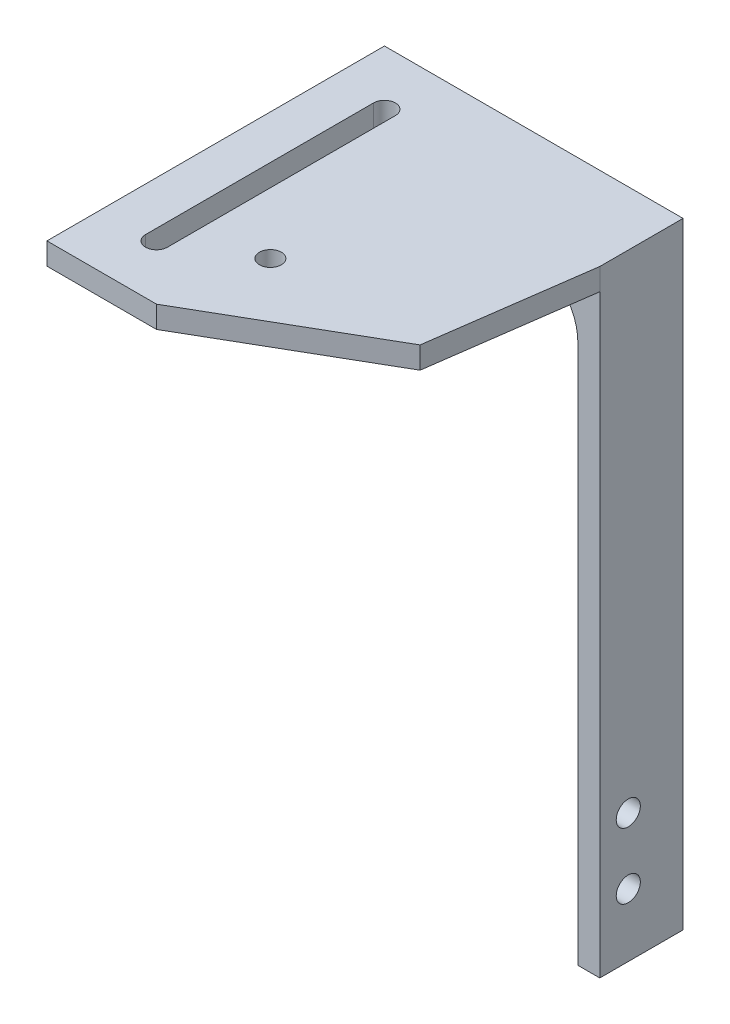
ISO-10303-21;
HEADER;
FILE_DESCRIPTION(('STEP AP214'),'2;1');
FILE_NAME('part.step','',(''),(''),'','','');
FILE_SCHEMA(('AUTOMOTIVE_DESIGN { 1 0 10303 214 1 1 1 1 }'));
ENDSEC;
DATA;
#1=APPLICATION_CONTEXT('core data for automotive mechanical design processes');
#2=APPLICATION_PROTOCOL_DEFINITION('international standard','automotive_design',2000,#1);
#3=PRODUCT_CONTEXT('',#1,'mechanical');
#4=PRODUCT('Part','Part','',(#3));
#5=PRODUCT_RELATED_PRODUCT_CATEGORY('part','',(#4));
#6=PRODUCT_DEFINITION_FORMATION('','',#4);
#7=PRODUCT_DEFINITION_CONTEXT('part definition',#1,'design');
#8=PRODUCT_DEFINITION('design','',#6,#7);
#9=PRODUCT_DEFINITION_SHAPE('','',#8);
#10=(LENGTH_UNIT() NAMED_UNIT(*) SI_UNIT(.MILLI.,.METRE.));
#11=(NAMED_UNIT(*) PLANE_ANGLE_UNIT() SI_UNIT($,.RADIAN.));
#12=(NAMED_UNIT(*) SI_UNIT($,.STERADIAN.) SOLID_ANGLE_UNIT());
#13=UNCERTAINTY_MEASURE_WITH_UNIT(LENGTH_MEASURE(1.E-05),#10,'distance_accuracy_value','');
#14=(GEOMETRIC_REPRESENTATION_CONTEXT(3) GLOBAL_UNCERTAINTY_ASSIGNED_CONTEXT((#13)) GLOBAL_UNIT_ASSIGNED_CONTEXT((#10,
#11,#12)) REPRESENTATION_CONTEXT('',''));
#15=CARTESIAN_POINT('',(0.,0.,0.));
#16=DIRECTION('',(0.,0.,1.));
#17=DIRECTION('',(1.,0.,0.));
#18=AXIS2_PLACEMENT_3D('',#15,#16,#17);
#19=CARTESIAN_POINT('',(60.75,0.,0.));
#20=DIRECTION('',(-1.,0.,0.));
#21=DIRECTION('',(0.,1.,0.));
#22=AXIS2_PLACEMENT_3D('',#19,#20,#21);
#23=PLANE('',#22);
#24=CARTESIAN_POINT('',(60.75,3.50000000000001,1.));
#25=DIRECTION('',(1.,0.,0.));
#26=DIRECTION('',(0.,1.,0.));
#27=AXIS2_PLACEMENT_3D('',#24,#25,#26);
#28=CIRCLE('',#27,1.1);
#29=CARTESIAN_POINT('',(60.75,4.60000000000001,1.));
#30=VERTEX_POINT('',#29);
#31=EDGE_CURVE('E185',#30,#30,#28,.T.);
#32=ORIENTED_EDGE('',*,*,#31,.T.);
#33=EDGE_LOOP('',(#32));
#34=FACE_BOUND('',#33,.T.);
#35=CARTESIAN_POINT('',(60.75,9.50000000000001,1.));
#36=DIRECTION('',(1.,0.,0.));
#37=DIRECTION('',(0.,1.,0.));
#38=AXIS2_PLACEMENT_3D('',#35,#36,#37);
#39=CIRCLE('',#38,1.1);
#40=CARTESIAN_POINT('',(60.75,10.6,1.));
#41=VERTEX_POINT('',#40);
#42=EDGE_CURVE('E177',#41,#41,#39,.T.);
#43=ORIENTED_EDGE('',*,*,#42,.T.);
#44=EDGE_LOOP('',(#43));
#45=FACE_BOUND('',#44,.T.);
#46=DIRECTION('',(0.,1.,0.));
#47=VECTOR('',#46,1.);
#48=CARTESIAN_POINT('',(60.75,-2.24999999999999,-4.));
#49=LINE('',#48,#47);
#50=CARTESIAN_POINT('',(60.75,-2.24999999999999,-4.));
#51=VERTEX_POINT('',#50);
#52=CARTESIAN_POINT('',(60.75,46.986195028983,-4.));
#53=VERTEX_POINT('',#52);
#54=EDGE_CURVE('E194',#51,#53,#49,.T.);
#55=ORIENTED_EDGE('',*,*,#54,.F.);
#56=DIRECTION('',(0.,0.,-1.));
#57=VECTOR('',#56,1.);
#58=CARTESIAN_POINT('',(60.75,-2.24999999999999,3.59922622331936));
#59=LINE('',#58,#57);
#60=CARTESIAN_POINT('',(60.75,-2.24999999999999,3.59922622331936));
#61=VERTEX_POINT('',#60);
#62=EDGE_CURVE('E191',#61,#51,#59,.T.);
#63=ORIENTED_EDGE('',*,*,#62,.F.);
#64=DIRECTION('',(0.,-1.,0.));
#65=VECTOR('',#64,1.);
#66=CARTESIAN_POINT('',(60.75,53.986195028983,3.59922622331937));
#67=LINE('',#66,#65);
#68=CARTESIAN_POINT('',(60.75,46.986195028983,3.59922622331937));
#69=VERTEX_POINT('',#68);
#70=EDGE_CURVE('E198',#69,#61,#67,.T.);
#71=ORIENTED_EDGE('',*,*,#70,.F.);
#72=DIRECTION('',(0.,0.,-1.));
#73=VECTOR('',#72,1.);
#74=CARTESIAN_POINT('',(60.75,46.986195028983,0.));
#75=LINE('',#74,#73);
#76=EDGE_CURVE('E220',#53,#69,#75,.F.);
#77=ORIENTED_EDGE('',*,*,#76,.F.);
#78=EDGE_LOOP('',(#55,#63,#71,#77));
#79=FACE_BOUND('',#78,.T.);
#80=ADVANCED_FACE('F45',(#34,#45,#79),#23,.T.);
#81=CARTESIAN_POINT('',(60.75,53.986195028983,3.59922622331937));
#82=DIRECTION('',(0.,0.,-1.));
#83=DIRECTION('',(0.,1.,0.));
#84=AXIS2_PLACEMENT_3D('',#81,#82,#83);
#85=PLANE('',#84);
#86=DIRECTION('',(-1.,0.,0.));
#87=VECTOR('',#86,1.);
#88=CARTESIAN_POINT('',(71.,51.986195028983,3.59922622331937));
#89=LINE('',#88,#87);
#90=CARTESIAN_POINT('',(62.75,51.986195028983,3.59922622331937));
#91=VERTEX_POINT('',#90);
#92=CARTESIAN_POINT('',(55.75,51.986195028983,3.59922622331937));
#93=VERTEX_POINT('',#92);
#94=EDGE_CURVE('E248',#91,#93,#89,.T.);
#95=ORIENTED_EDGE('',*,*,#94,.T.);
#96=CARTESIAN_POINT('',(55.75,46.986195028983,3.59922622331937));
#97=DIRECTION('',(0.,0.,1.));
#98=DIRECTION('',(0.,1.,0.));
#99=AXIS2_PLACEMENT_3D('',#96,#97,#98);
#100=CIRCLE('',#99,5.);
#101=EDGE_CURVE('E11',#69,#93,#100,.T.);
#102=ORIENTED_EDGE('',*,*,#101,.F.);
#103=ORIENTED_EDGE('',*,*,#70,.T.);
#104=DIRECTION('',(1.,0.,0.));
#105=VECTOR('',#104,1.);
#106=CARTESIAN_POINT('',(60.75,-2.24999999999999,3.59922622331936));
#107=LINE('',#106,#105);
#108=CARTESIAN_POINT('',(62.75,-2.24999999999999,3.59922622331936));
#109=VERTEX_POINT('',#108);
#110=EDGE_CURVE('E200',#61,#109,#107,.T.);
#111=ORIENTED_EDGE('',*,*,#110,.T.);
#112=DIRECTION('',(0.,-1.,0.));
#113=VECTOR('',#112,1.);
#114=CARTESIAN_POINT('',(62.75,53.986195028983,3.59922622331937));
#115=LINE('',#114,#113);
#116=EDGE_CURVE('E209',#91,#109,#115,.T.);
#117=ORIENTED_EDGE('',*,*,#116,.F.);
#118=EDGE_LOOP('',(#95,#102,#103,#111,#117));
#119=FACE_BOUND('',#118,.T.);
#120=ADVANCED_FACE('F226',(#119),#85,.F.);
#121=CARTESIAN_POINT('',(62.75,0.,0.));
#122=DIRECTION('',(-1.,0.,0.));
#123=DIRECTION('',(0.,1.,0.));
#124=AXIS2_PLACEMENT_3D('',#121,#122,#123);
#125=PLANE('',#124);
#126=DIRECTION('',(0.,0.,-1.));
#127=VECTOR('',#126,1.);
#128=CARTESIAN_POINT('',(62.75,-2.24999999999999,3.59922622331936));
#129=LINE('',#128,#127);
#130=CARTESIAN_POINT('',(62.75,-2.24999999999999,-4.));
#131=VERTEX_POINT('',#130);
#132=EDGE_CURVE('E188',#109,#131,#129,.T.);
#133=ORIENTED_EDGE('',*,*,#132,.T.);
#134=DIRECTION('',(0.,1.,0.));
#135=VECTOR('',#134,1.);
#136=CARTESIAN_POINT('',(62.75,-2.24999999999999,-4.));
#137=LINE('',#136,#135);
#138=CARTESIAN_POINT('',(62.75,53.986195028983,-4.));
#139=VERTEX_POINT('',#138);
#140=EDGE_CURVE('E203',#131,#139,#137,.T.);
#141=ORIENTED_EDGE('',*,*,#140,.T.);
#142=DIRECTION('',(0.,0.,1.));
#143=VECTOR('',#142,1.);
#144=CARTESIAN_POINT('',(62.75,53.986195028983,-4.));
#145=LINE('',#144,#143);
#146=CARTESIAN_POINT('',(62.75,53.986195028983,3.59922622331937));
#147=VERTEX_POINT('',#146);
#148=EDGE_CURVE('E206',#139,#147,#145,.T.);
#149=ORIENTED_EDGE('',*,*,#148,.T.);
#150=EDGE_CURVE('E195',#147,#91,#115,.T.);
#151=ORIENTED_EDGE('',*,*,#150,.T.);
#152=ORIENTED_EDGE('',*,*,#116,.T.);
#153=EDGE_LOOP('',(#133,#141,#149,#151,#152));
#154=FACE_BOUND('',#153,.T.);
#155=CARTESIAN_POINT('',(62.75,3.50000000000001,1.));
#156=DIRECTION('',(1.,0.,0.));
#157=DIRECTION('',(0.,1.,0.));
#158=AXIS2_PLACEMENT_3D('',#155,#156,#157);
#159=CIRCLE('',#158,1.1);
#160=CARTESIAN_POINT('',(62.75,4.60000000000001,1.));
#161=VERTEX_POINT('',#160);
#162=EDGE_CURVE('E180',#161,#161,#159,.T.);
#163=ORIENTED_EDGE('',*,*,#162,.F.);
#164=EDGE_LOOP('',(#163));
#165=FACE_BOUND('',#164,.T.);
#166=CARTESIAN_POINT('',(62.75,9.50000000000001,1.));
#167=DIRECTION('',(1.,0.,0.));
#168=DIRECTION('',(0.,1.,0.));
#169=AXIS2_PLACEMENT_3D('',#166,#167,#168);
#170=CIRCLE('',#169,1.1);
#171=CARTESIAN_POINT('',(62.75,10.6,1.));
#172=VERTEX_POINT('',#171);
#173=EDGE_CURVE('E181',#172,#172,#170,.T.);
#174=ORIENTED_EDGE('',*,*,#173,.F.);
#175=EDGE_LOOP('',(#174));
#176=FACE_BOUND('',#175,.T.);
#177=ADVANCED_FACE('F234',(#154,#165,#176),#125,.F.);
#178=CARTESIAN_POINT('',(60.75,-2.24999999999999,3.59922622331936));
#179=DIRECTION('',(0.,1.,0.));
#180=DIRECTION('',(1.,0.,0.));
#181=AXIS2_PLACEMENT_3D('',#178,#179,#180);
#182=PLANE('',#181);
#183=ORIENTED_EDGE('',*,*,#132,.F.);
#184=ORIENTED_EDGE('',*,*,#110,.F.);
#185=ORIENTED_EDGE('',*,*,#62,.T.);
#186=DIRECTION('',(1.,0.,0.));
#187=VECTOR('',#186,1.);
#188=CARTESIAN_POINT('',(60.75,-2.24999999999999,-4.));
#189=LINE('',#188,#187);
#190=EDGE_CURVE('E216',#51,#131,#189,.T.);
#191=ORIENTED_EDGE('',*,*,#190,.T.);
#192=EDGE_LOOP('',(#183,#184,#185,#191));
#193=FACE_BOUND('',#192,.T.);
#194=ADVANCED_FACE('F231',(#193),#182,.F.);
#195=CARTESIAN_POINT('',(60.75,-2.24999999999999,-4.));
#196=DIRECTION('',(0.,0.,1.));
#197=DIRECTION('',(-1.,0.,0.));
#198=AXIS2_PLACEMENT_3D('',#195,#196,#197);
#199=PLANE('',#198);
#200=ORIENTED_EDGE('',*,*,#140,.F.);
#201=ORIENTED_EDGE('',*,*,#190,.F.);
#202=ORIENTED_EDGE('',*,*,#54,.T.);
#203=CARTESIAN_POINT('',(55.75,46.986195028983,-4.));
#204=DIRECTION('',(0.,0.,-1.));
#205=DIRECTION('',(-1.,0.,0.));
#206=AXIS2_PLACEMENT_3D('',#203,#204,#205);
#207=CIRCLE('',#206,5.);
#208=CARTESIAN_POINT('',(55.75,51.986195028983,-4.));
#209=VERTEX_POINT('',#208);
#210=EDGE_CURVE('E54',#209,#53,#207,.T.);
#211=ORIENTED_EDGE('',*,*,#210,.F.);
#212=DIRECTION('',(1.,0.,0.));
#213=VECTOR('',#212,1.);
#214=CARTESIAN_POINT('',(71.,51.986195028983,-4.));
#215=LINE('',#214,#213);
#216=CARTESIAN_POINT('',(35.5,51.986195028983,-4.));
#217=VERTEX_POINT('',#216);
#218=EDGE_CURVE('E168',#217,#209,#215,.T.);
#219=ORIENTED_EDGE('',*,*,#218,.F.);
#220=DIRECTION('',(0.,1.,0.));
#221=VECTOR('',#220,1.);
#222=CARTESIAN_POINT('',(35.5,51.986195028983,-4.));
#223=LINE('',#222,#221);
#224=CARTESIAN_POINT('',(35.5,53.986195028983,-4.));
#225=VERTEX_POINT('',#224);
#226=EDGE_CURVE('E184',#217,#225,#223,.T.);
#227=ORIENTED_EDGE('',*,*,#226,.T.);
#228=DIRECTION('',(1.,0.,0.));
#229=VECTOR('',#228,1.);
#230=CARTESIAN_POINT('',(60.75,53.986195028983,-4.));
#231=LINE('',#230,#229);
#232=EDGE_CURVE('E214',#225,#139,#231,.T.);
#233=ORIENTED_EDGE('',*,*,#232,.T.);
#234=EDGE_LOOP('',(#200,#201,#202,#211,#219,#227,#233));
#235=FACE_BOUND('',#234,.T.);
#236=ADVANCED_FACE('F293',(#235),#199,.F.);
#237=CARTESIAN_POINT('',(60.75,53.986195028983,-4.));
#238=DIRECTION('',(0.,-1.,0.));
#239=DIRECTION('',(-1.,0.,0.));
#240=AXIS2_PLACEMENT_3D('',#237,#238,#239);
#241=PLANE('',#240);
#242=CARTESIAN_POINT('',(47.0897459621554,53.986195028983,18.));
#243=DIRECTION('',(0.,-1.,0.));
#244=DIRECTION('',(1.,0.,0.));
#245=AXIS2_PLACEMENT_3D('',#242,#243,#244);
#246=CIRCLE('',#245,0.999999999999998);
#247=CARTESIAN_POINT('',(48.0897459621554,53.986195028983,18.));
#248=VERTEX_POINT('',#247);
#249=EDGE_CURVE('E475',#248,#248,#246,.F.);
#250=ORIENTED_EDGE('',*,*,#249,.F.);
#251=EDGE_LOOP('',(#250));
#252=FACE_BOUND('',#251,.T.);
#253=ORIENTED_EDGE('',*,*,#148,.F.);
#254=ORIENTED_EDGE('',*,*,#232,.F.);
#255=DIRECTION('',(0.,0.,-1.));
#256=VECTOR('',#255,1.);
#257=CARTESIAN_POINT('',(35.5,53.986195028983,0.));
#258=LINE('',#257,#256);
#259=CARTESIAN_POINT('',(35.5,53.986195028983,26.8045916051417));
#260=VERTEX_POINT('',#259);
#261=EDGE_CURVE('E162',#260,#225,#258,.T.);
#262=ORIENTED_EDGE('',*,*,#261,.F.);
#263=DIRECTION('',(-1.,0.,0.));
#264=VECTOR('',#263,1.);
#265=CARTESIAN_POINT('',(71.,53.986195028983,26.8045916051417));
#266=LINE('',#265,#264);
#267=CARTESIAN_POINT('',(45.5,53.986195028983,26.8045916051417));
#268=VERTEX_POINT('',#267);
#269=EDGE_CURVE('E270',#268,#260,#266,.T.);
#270=ORIENTED_EDGE('',*,*,#269,.F.);
#271=DIRECTION('',(-0.866025403784442,0.,0.499999999999995));
#272=VECTOR('',#271,1.);
#273=CARTESIAN_POINT('',(76.23172863406,53.986195028983,9.06161980560487));
#274=LINE('',#273,#272);
#275=CARTESIAN_POINT('',(60.75,53.986195028983,18.));
#276=VERTEX_POINT('',#275);
#277=EDGE_CURVE('E267',#276,#268,#274,.T.);
#278=ORIENTED_EDGE('',*,*,#277,.F.);
#279=DIRECTION('',(-0.137561119383968,0.,0.990493280357737));
#280=VECTOR('',#279,1.);
#281=CARTESIAN_POINT('',(63.3965219400428,53.986195028983,-1.0559818767891));
#282=LINE('',#281,#280);
#283=EDGE_CURVE('E242',#147,#276,#282,.T.);
#284=ORIENTED_EDGE('',*,*,#283,.F.);
#285=EDGE_LOOP('',(#253,#254,#262,#270,#278,#284));
#286=FACE_BOUND('',#285,.T.);
#287=CARTESIAN_POINT('',(40.5,53.986195028983,21.8045916051417));
#288=DIRECTION('',(0.,-1.,0.));
#289=DIRECTION('',(1.,0.,0.));
#290=AXIS2_PLACEMENT_3D('',#287,#288,#289);
#291=CIRCLE('',#290,1.);
#292=CARTESIAN_POINT('',(41.5,53.986195028983,21.8045916051417));
#293=VERTEX_POINT('',#292);
#294=CARTESIAN_POINT('',(39.5,53.986195028983,21.8045916051417));
#295=VERTEX_POINT('',#294);
#296=EDGE_CURVE('E167',#293,#295,#291,.T.);
#297=ORIENTED_EDGE('',*,*,#296,.T.);
#298=DIRECTION('',(0.,0.,1.));
#299=VECTOR('',#298,1.);
#300=CARTESIAN_POINT('',(39.5,53.986195028983,0.));
#301=LINE('',#300,#299);
#302=CARTESIAN_POINT('',(39.5,53.986195028983,1.));
#303=VERTEX_POINT('',#302);
#304=EDGE_CURVE('E263',#303,#295,#301,.T.);
#305=ORIENTED_EDGE('',*,*,#304,.F.);
#306=CARTESIAN_POINT('',(40.5,53.986195028983,1.));
#307=DIRECTION('',(0.,-1.,0.));
#308=DIRECTION('',(1.,0.,0.));
#309=AXIS2_PLACEMENT_3D('',#306,#307,#308);
#310=CIRCLE('',#309,0.999999999999997);
#311=CARTESIAN_POINT('',(41.5,53.986195028983,1.));
#312=VERTEX_POINT('',#311);
#313=EDGE_CURVE('E260',#303,#312,#310,.T.);
#314=ORIENTED_EDGE('',*,*,#313,.T.);
#315=DIRECTION('',(0.,0.,1.));
#316=VECTOR('',#315,1.);
#317=CARTESIAN_POINT('',(41.5,53.986195028983,0.));
#318=LINE('',#317,#316);
#319=EDGE_CURVE('E258',#312,#293,#318,.T.);
#320=ORIENTED_EDGE('',*,*,#319,.T.);
#321=EDGE_LOOP('',(#297,#305,#314,#320));
#322=FACE_BOUND('',#321,.T.);
#323=ADVANCED_FACE('F290',(#252,#286,#322),#241,.F.);
#324=CARTESIAN_POINT('',(60.75,3.50000000000001,1.));
#325=DIRECTION('',(1.,0.,0.));
#326=DIRECTION('',(0.,-1.,0.));
#327=AXIS2_PLACEMENT_3D('',#324,#325,#326);
#328=CYLINDRICAL_SURFACE('',#327,1.1);
#329=ORIENTED_EDGE('',*,*,#31,.F.);
#330=EDGE_LOOP('',(#329));
#331=FACE_BOUND('',#330,.T.);
#332=ORIENTED_EDGE('',*,*,#162,.T.);
#333=EDGE_LOOP('',(#332));
#334=FACE_BOUND('',#333,.T.);
#335=ADVANCED_FACE('F292',(#331,#334),#328,.F.);
#336=CARTESIAN_POINT('',(60.75,9.50000000000001,1.));
#337=DIRECTION('',(1.,0.,0.));
#338=DIRECTION('',(0.,-1.,0.));
#339=AXIS2_PLACEMENT_3D('',#336,#337,#338);
#340=CYLINDRICAL_SURFACE('',#339,1.1);
#341=ORIENTED_EDGE('',*,*,#42,.F.);
#342=EDGE_LOOP('',(#341));
#343=FACE_BOUND('',#342,.T.);
#344=ORIENTED_EDGE('',*,*,#173,.T.);
#345=EDGE_LOOP('',(#344));
#346=FACE_BOUND('',#345,.T.);
#347=ADVANCED_FACE('F300',(#343,#346),#340,.F.);
#348=CARTESIAN_POINT('',(35.5,51.986195028983,0.));
#349=DIRECTION('',(-1.,0.,0.));
#350=DIRECTION('',(0.,1.,0.));
#351=AXIS2_PLACEMENT_3D('',#348,#349,#350);
#352=PLANE('',#351);
#353=ORIENTED_EDGE('',*,*,#261,.T.);
#354=ORIENTED_EDGE('',*,*,#226,.F.);
#355=DIRECTION('',(0.,0.,-1.));
#356=VECTOR('',#355,1.);
#357=CARTESIAN_POINT('',(35.5,51.986195028983,0.));
#358=LINE('',#357,#356);
#359=CARTESIAN_POINT('',(35.5,51.986195028983,26.8045916051417));
#360=VERTEX_POINT('',#359);
#361=EDGE_CURVE('E173',#360,#217,#358,.T.);
#362=ORIENTED_EDGE('',*,*,#361,.F.);
#363=DIRECTION('',(0.,1.,0.));
#364=VECTOR('',#363,1.);
#365=CARTESIAN_POINT('',(35.5,51.986195028983,26.8045916051417));
#366=LINE('',#365,#364);
#367=EDGE_CURVE('E276',#360,#260,#366,.T.);
#368=ORIENTED_EDGE('',*,*,#367,.T.);
#369=EDGE_LOOP('',(#353,#354,#362,#368));
#370=FACE_BOUND('',#369,.T.);
#371=ADVANCED_FACE('F358',(#370),#352,.T.);
#372=CARTESIAN_POINT('',(71.,51.986195028983,26.8045916051417));
#373=DIRECTION('',(0.,0.,1.));
#374=DIRECTION('',(-1.,0.,0.));
#375=AXIS2_PLACEMENT_3D('',#372,#373,#374);
#376=PLANE('',#375);
#377=ORIENTED_EDGE('',*,*,#269,.T.);
#378=ORIENTED_EDGE('',*,*,#367,.F.);
#379=DIRECTION('',(-1.,0.,0.));
#380=VECTOR('',#379,1.);
#381=CARTESIAN_POINT('',(71.,51.986195028983,26.8045916051417));
#382=LINE('',#381,#380);
#383=CARTESIAN_POINT('',(45.5,51.986195028983,26.8045916051417));
#384=VERTEX_POINT('',#383);
#385=EDGE_CURVE('E250',#384,#360,#382,.T.);
#386=ORIENTED_EDGE('',*,*,#385,.F.);
#387=DIRECTION('',(0.,1.,0.));
#388=VECTOR('',#387,1.);
#389=CARTESIAN_POINT('',(45.5,51.986195028983,26.8045916051417));
#390=LINE('',#389,#388);
#391=EDGE_CURVE('E278',#384,#268,#390,.T.);
#392=ORIENTED_EDGE('',*,*,#391,.T.);
#393=EDGE_LOOP('',(#377,#378,#386,#392));
#394=FACE_BOUND('',#393,.T.);
#395=ADVANCED_FACE('F367',(#394),#376,.T.);
#396=CARTESIAN_POINT('',(76.23172863406,51.986195028983,9.06161980560487));
#397=DIRECTION('',(0.499999999999995,0.,0.866025403784442));
#398=DIRECTION('',(-0.866025403784442,0.,0.499999999999995));
#399=AXIS2_PLACEMENT_3D('',#396,#397,#398);
#400=PLANE('',#399);
#401=ORIENTED_EDGE('',*,*,#277,.T.);
#402=ORIENTED_EDGE('',*,*,#391,.F.);
#403=DIRECTION('',(-0.866025403784442,0.,0.499999999999995));
#404=VECTOR('',#403,1.);
#405=CARTESIAN_POINT('',(76.23172863406,51.986195028983,9.06161980560487));
#406=LINE('',#405,#404);
#407=CARTESIAN_POINT('',(60.75,51.986195028983,18.));
#408=VERTEX_POINT('',#407);
#409=EDGE_CURVE('E247',#408,#384,#406,.T.);
#410=ORIENTED_EDGE('',*,*,#409,.F.);
#411=DIRECTION('',(0.,1.,0.));
#412=VECTOR('',#411,1.);
#413=CARTESIAN_POINT('',(60.75,51.986195028983,18.));
#414=LINE('',#413,#412);
#415=EDGE_CURVE('E245',#408,#276,#414,.T.);
#416=ORIENTED_EDGE('',*,*,#415,.T.);
#417=EDGE_LOOP('',(#401,#402,#410,#416));
#418=FACE_BOUND('',#417,.T.);
#419=ADVANCED_FACE('F377',(#418),#400,.T.);
#420=CARTESIAN_POINT('',(63.3965219400428,51.986195028983,-1.0559818767891));
#421=DIRECTION('',(0.990493280357737,0.,0.137561119383968));
#422=DIRECTION('',(-0.137561119383968,0.,0.990493280357737));
#423=AXIS2_PLACEMENT_3D('',#420,#421,#422);
#424=PLANE('',#423);
#425=ORIENTED_EDGE('',*,*,#283,.T.);
#426=ORIENTED_EDGE('',*,*,#415,.F.);
#427=DIRECTION('',(-0.137561119383968,0.,0.990493280357737));
#428=VECTOR('',#427,1.);
#429=CARTESIAN_POINT('',(63.3965219400428,51.986195028983,-1.0559818767891));
#430=LINE('',#429,#428);
#431=EDGE_CURVE('E244',#91,#408,#430,.T.);
#432=ORIENTED_EDGE('',*,*,#431,.F.);
#433=ORIENTED_EDGE('',*,*,#150,.F.);
#434=EDGE_LOOP('',(#425,#426,#432,#433));
#435=FACE_BOUND('',#434,.T.);
#436=ADVANCED_FACE('F240',(#435),#424,.T.);
#437=CARTESIAN_POINT('',(40.5,51.986195028983,21.8045916051417));
#438=DIRECTION('',(0.,1.,0.));
#439=DIRECTION('',(1.,0.,0.));
#440=AXIS2_PLACEMENT_3D('',#437,#438,#439);
#441=CYLINDRICAL_SURFACE('',#440,1.);
#442=ORIENTED_EDGE('',*,*,#296,.F.);
#443=DIRECTION('',(0.,1.,0.));
#444=VECTOR('',#443,1.);
#445=CARTESIAN_POINT('',(41.5,51.986195028983,21.8045916051417));
#446=LINE('',#445,#444);
#447=CARTESIAN_POINT('',(41.5,51.986195028983,21.8045916051417));
#448=VERTEX_POINT('',#447);
#449=EDGE_CURVE('E147',#448,#293,#446,.T.);
#450=ORIENTED_EDGE('',*,*,#449,.F.);
#451=CARTESIAN_POINT('',(40.5,51.986195028983,21.8045916051417));
#452=DIRECTION('',(0.,-1.,0.));
#453=DIRECTION('',(1.,0.,0.));
#454=AXIS2_PLACEMENT_3D('',#451,#452,#453);
#455=CIRCLE('',#454,1.);
#456=CARTESIAN_POINT('',(39.5,51.986195028983,21.8045916051417));
#457=VERTEX_POINT('',#456);
#458=EDGE_CURVE('E153',#448,#457,#455,.T.);
#459=ORIENTED_EDGE('',*,*,#458,.T.);
#460=DIRECTION('',(0.,1.,0.));
#461=VECTOR('',#460,1.);
#462=CARTESIAN_POINT('',(39.5,51.986195028983,21.8045916051417));
#463=LINE('',#462,#461);
#464=EDGE_CURVE('E281',#457,#295,#463,.T.);
#465=ORIENTED_EDGE('',*,*,#464,.T.);
#466=EDGE_LOOP('',(#442,#450,#459,#465));
#467=FACE_BOUND('',#466,.T.);
#468=ADVANCED_FACE('F165',(#467),#441,.F.);
#469=CARTESIAN_POINT('',(39.5,51.986195028983,0.));
#470=DIRECTION('',(1.,0.,0.));
#471=DIRECTION('',(0.,0.,1.));
#472=AXIS2_PLACEMENT_3D('',#469,#470,#471);
#473=PLANE('',#472);
#474=ORIENTED_EDGE('',*,*,#304,.T.);
#475=ORIENTED_EDGE('',*,*,#464,.F.);
#476=DIRECTION('',(0.,0.,1.));
#477=VECTOR('',#476,1.);
#478=CARTESIAN_POINT('',(39.5,51.986195028983,0.));
#479=LINE('',#478,#477);
#480=CARTESIAN_POINT('',(39.5,51.986195028983,1.));
#481=VERTEX_POINT('',#480);
#482=EDGE_CURVE('E159',#481,#457,#479,.T.);
#483=ORIENTED_EDGE('',*,*,#482,.F.);
#484=DIRECTION('',(0.,1.,0.));
#485=VECTOR('',#484,1.);
#486=CARTESIAN_POINT('',(39.5,51.986195028983,1.));
#487=LINE('',#486,#485);
#488=EDGE_CURVE('E170',#481,#303,#487,.T.);
#489=ORIENTED_EDGE('',*,*,#488,.T.);
#490=EDGE_LOOP('',(#474,#475,#483,#489));
#491=FACE_BOUND('',#490,.T.);
#492=ADVANCED_FACE('F285',(#491),#473,.T.);
#493=CARTESIAN_POINT('',(40.5,51.986195028983,1.));
#494=DIRECTION('',(0.,1.,0.));
#495=DIRECTION('',(1.,0.,0.));
#496=AXIS2_PLACEMENT_3D('',#493,#494,#495);
#497=CYLINDRICAL_SURFACE('',#496,0.999999999999997);
#498=ORIENTED_EDGE('',*,*,#313,.F.);
#499=ORIENTED_EDGE('',*,*,#488,.F.);
#500=CARTESIAN_POINT('',(40.5,51.986195028983,1.));
#501=DIRECTION('',(0.,-1.,0.));
#502=DIRECTION('',(1.,0.,0.));
#503=AXIS2_PLACEMENT_3D('',#500,#501,#502);
#504=CIRCLE('',#503,0.999999999999997);
#505=CARTESIAN_POINT('',(41.5,51.986195028983,1.));
#506=VERTEX_POINT('',#505);
#507=EDGE_CURVE('E152',#481,#506,#504,.T.);
#508=ORIENTED_EDGE('',*,*,#507,.T.);
#509=DIRECTION('',(0.,1.,0.));
#510=VECTOR('',#509,1.);
#511=CARTESIAN_POINT('',(41.5,51.986195028983,1.));
#512=LINE('',#511,#510);
#513=EDGE_CURVE('E149',#506,#312,#512,.T.);
#514=ORIENTED_EDGE('',*,*,#513,.T.);
#515=EDGE_LOOP('',(#498,#499,#508,#514));
#516=FACE_BOUND('',#515,.T.);
#517=ADVANCED_FACE('F288',(#516),#497,.F.);
#518=CARTESIAN_POINT('',(41.5,51.986195028983,0.));
#519=DIRECTION('',(1.,0.,0.));
#520=DIRECTION('',(0.,-1.,0.));
#521=AXIS2_PLACEMENT_3D('',#518,#519,#520);
#522=PLANE('',#521);
#523=ORIENTED_EDGE('',*,*,#319,.F.);
#524=ORIENTED_EDGE('',*,*,#513,.F.);
#525=DIRECTION('',(0.,0.,1.));
#526=VECTOR('',#525,1.);
#527=CARTESIAN_POINT('',(41.5,51.986195028983,0.));
#528=LINE('',#527,#526);
#529=EDGE_CURVE('E142',#506,#448,#528,.T.);
#530=ORIENTED_EDGE('',*,*,#529,.T.);
#531=ORIENTED_EDGE('',*,*,#449,.T.);
#532=EDGE_LOOP('',(#523,#524,#530,#531));
#533=FACE_BOUND('',#532,.T.);
#534=ADVANCED_FACE('F145',(#533),#522,.F.);
#535=CARTESIAN_POINT('',(71.,51.986195028983,0.));
#536=DIRECTION('',(0.,1.,0.));
#537=DIRECTION('',(1.,0.,0.));
#538=AXIS2_PLACEMENT_3D('',#535,#536,#537);
#539=PLANE('',#538);
#540=CARTESIAN_POINT('',(47.0897459621554,51.986195028983,18.));
#541=DIRECTION('',(0.,1.,0.));
#542=DIRECTION('',(-1.,0.,0.));
#543=AXIS2_PLACEMENT_3D('',#540,#541,#542);
#544=CIRCLE('',#543,0.999999999999998);
#545=CARTESIAN_POINT('',(46.0897459621554,51.986195028983,18.));
#546=VERTEX_POINT('',#545);
#547=EDGE_CURVE('E49',#546,#546,#544,.T.);
#548=ORIENTED_EDGE('',*,*,#547,.T.);
#549=EDGE_LOOP('',(#548));
#550=FACE_BOUND('',#549,.T.);
#551=ORIENTED_EDGE('',*,*,#458,.F.);
#552=ORIENTED_EDGE('',*,*,#529,.F.);
#553=ORIENTED_EDGE('',*,*,#507,.F.);
#554=ORIENTED_EDGE('',*,*,#482,.T.);
#555=EDGE_LOOP('',(#551,#552,#553,#554));
#556=FACE_BOUND('',#555,.T.);
#557=ORIENTED_EDGE('',*,*,#94,.F.);
#558=ORIENTED_EDGE('',*,*,#431,.T.);
#559=ORIENTED_EDGE('',*,*,#409,.T.);
#560=ORIENTED_EDGE('',*,*,#385,.T.);
#561=ORIENTED_EDGE('',*,*,#361,.T.);
#562=ORIENTED_EDGE('',*,*,#218,.T.);
#563=DIRECTION('',(0.,0.,-1.));
#564=VECTOR('',#563,1.);
#565=CARTESIAN_POINT('',(55.75,51.986195028983,0.));
#566=LINE('',#565,#564);
#567=EDGE_CURVE('E218',#93,#209,#566,.T.);
#568=ORIENTED_EDGE('',*,*,#567,.F.);
#569=EDGE_LOOP('',(#557,#558,#559,#560,#561,#562,#568));
#570=FACE_BOUND('',#569,.T.);
#571=ADVANCED_FACE('F156',(#550,#556,#570),#539,.F.);
#572=CARTESIAN_POINT('',(55.75,46.986195028983,0.));
#573=DIRECTION('',(0.,0.,-1.));
#574=DIRECTION('',(0.,1.,0.));
#575=AXIS2_PLACEMENT_3D('',#572,#573,#574);
#576=CYLINDRICAL_SURFACE('',#575,5.);
#577=ORIENTED_EDGE('',*,*,#101,.T.);
#578=ORIENTED_EDGE('',*,*,#567,.T.);
#579=ORIENTED_EDGE('',*,*,#210,.T.);
#580=ORIENTED_EDGE('',*,*,#76,.T.);
#581=EDGE_LOOP('',(#577,#578,#579,#580));
#582=FACE_BOUND('',#581,.T.);
#583=ADVANCED_FACE('F47',(#582),#576,.F.);
#584=CARTESIAN_POINT('',(47.0897459621554,56.8146221537292,18.));
#585=DIRECTION('',(0.,-1.,0.));
#586=DIRECTION('',(1.,0.,0.));
#587=AXIS2_PLACEMENT_3D('',#584,#585,#586);
#588=CYLINDRICAL_SURFACE('',#587,0.999999999999998);
#589=ORIENTED_EDGE('',*,*,#249,.T.);
#590=EDGE_LOOP('',(#589));
#591=FACE_BOUND('',#590,.T.);
#592=ORIENTED_EDGE('',*,*,#547,.F.);
#593=EDGE_LOOP('',(#592));
#594=FACE_BOUND('',#593,.T.);
#595=ADVANCED_FACE('F437',(#591,#594),#588,.F.);
#596=CLOSED_SHELL('',(#80,#120,#177,#194,#236,#323,#335,#347,#371,#395,#419,#436,#468,#492,#517,
#534,#571,#583,#595));
#597=MANIFOLD_SOLID_BREP('B2',#596);
#598=ADVANCED_BREP_SHAPE_REPRESENTATION('',(#18,#597),#14);
#599=SHAPE_DEFINITION_REPRESENTATION(#9,#598);
ENDSEC;
END-ISO-10303-21;
